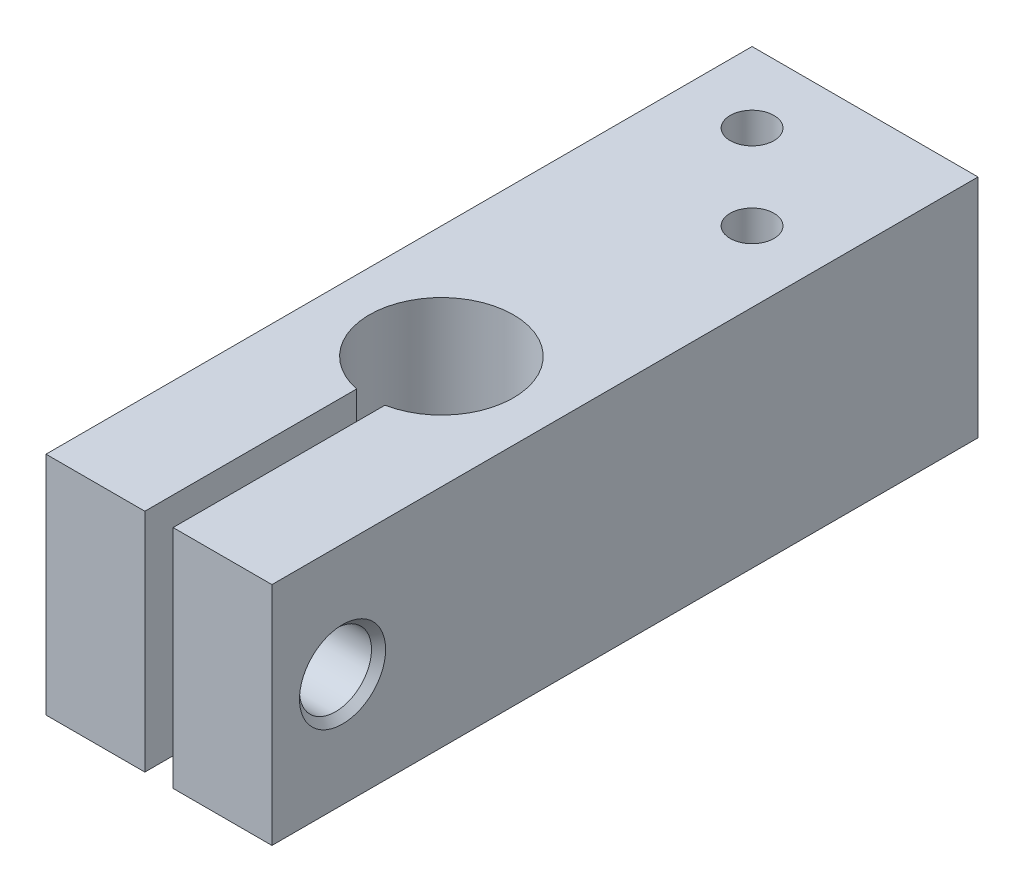
ISO-10303-21;
HEADER;
FILE_DESCRIPTION(('STEP AP214'),'2;1');
FILE_NAME('part.step','',(''),(''),'','','');
FILE_SCHEMA(('AUTOMOTIVE_DESIGN { 1 0 10303 214 1 1 1 1 }'));
ENDSEC;
DATA;
#1=APPLICATION_CONTEXT('core data for automotive mechanical design processes');
#2=APPLICATION_PROTOCOL_DEFINITION('international standard','automotive_design',2000,#1);
#3=PRODUCT_CONTEXT('',#1,'mechanical');
#4=PRODUCT('Part','Part','',(#3));
#5=PRODUCT_RELATED_PRODUCT_CATEGORY('part','',(#4));
#6=PRODUCT_DEFINITION_FORMATION('','',#4);
#7=PRODUCT_DEFINITION_CONTEXT('part definition',#1,'design');
#8=PRODUCT_DEFINITION('design','',#6,#7);
#9=PRODUCT_DEFINITION_SHAPE('','',#8);
#10=(LENGTH_UNIT() NAMED_UNIT(*) SI_UNIT(.MILLI.,.METRE.));
#11=(NAMED_UNIT(*) PLANE_ANGLE_UNIT() SI_UNIT($,.RADIAN.));
#12=(NAMED_UNIT(*) SI_UNIT($,.STERADIAN.) SOLID_ANGLE_UNIT());
#13=UNCERTAINTY_MEASURE_WITH_UNIT(LENGTH_MEASURE(1.E-05),#10,'distance_accuracy_value','');
#14=(GEOMETRIC_REPRESENTATION_CONTEXT(3) GLOBAL_UNCERTAINTY_ASSIGNED_CONTEXT((#13)) GLOBAL_UNIT_ASSIGNED_CONTEXT((#10,
#11,#12)) REPRESENTATION_CONTEXT('',''));
#15=CARTESIAN_POINT('',(0.,0.,0.));
#16=DIRECTION('',(0.,0.,1.));
#17=DIRECTION('',(1.,0.,0.));
#18=AXIS2_PLACEMENT_3D('',#15,#16,#17);
#19=CARTESIAN_POINT('',(8.,8.,50.));
#20=DIRECTION('',(0.,-1.,0.));
#21=DIRECTION('',(1.,0.,0.));
#22=AXIS2_PLACEMENT_3D('',#19,#20,#21);
#23=PLANE('',#22);
#24=CARTESIAN_POINT('',(3.,8.,11.));
#25=DIRECTION('',(0.,-1.,0.));
#26=DIRECTION('',(0.,0.,-1.));
#27=AXIS2_PLACEMENT_3D('',#24,#25,#26);
#28=CIRCLE('',#27,1.55);
#29=CARTESIAN_POINT('',(3.,8.,9.45));
#30=VERTEX_POINT('',#29);
#31=EDGE_CURVE('E335',#30,#30,#28,.T.);
#32=ORIENTED_EDGE('',*,*,#31,.T.);
#33=EDGE_LOOP('',(#32));
#34=FACE_BOUND('',#33,.T.);
#35=CARTESIAN_POINT('',(-3.,8.,5.));
#36=DIRECTION('',(0.,-1.,0.));
#37=DIRECTION('',(0.,0.,-1.));
#38=AXIS2_PLACEMENT_3D('',#35,#36,#37);
#39=CIRCLE('',#38,1.55);
#40=CARTESIAN_POINT('',(-3.,8.,3.45));
#41=VERTEX_POINT('',#40);
#42=EDGE_CURVE('E343',#41,#41,#39,.T.);
#43=ORIENTED_EDGE('',*,*,#42,.T.);
#44=EDGE_LOOP('',(#43));
#45=FACE_BOUND('',#44,.T.);
#46=CARTESIAN_POINT('',(0.,8.,30.));
#47=DIRECTION('',(0.,1.,0.));
#48=DIRECTION('',(0.,0.,1.));
#49=AXIS2_PLACEMENT_3D('',#46,#47,#48);
#50=CIRCLE('',#49,5.09999999999999);
#51=CARTESIAN_POINT('',(1.00000000000001,8.,35.00099990002));
#52=VERTEX_POINT('',#51);
#53=CARTESIAN_POINT('',(-0.999999999999999,8.,35.00099990002));
#54=VERTEX_POINT('',#53);
#55=EDGE_CURVE('E50',#52,#54,#50,.T.);
#56=ORIENTED_EDGE('',*,*,#55,.F.);
#57=DIRECTION('',(0.,0.,-1.));
#58=VECTOR('',#57,1.);
#59=CARTESIAN_POINT('',(1.00000000000001,8.,0.));
#60=LINE('',#59,#58);
#61=CARTESIAN_POINT('',(1.00000000000001,8.,50.));
#62=VERTEX_POINT('',#61);
#63=EDGE_CURVE('E108',#62,#52,#60,.T.);
#64=ORIENTED_EDGE('',*,*,#63,.F.);
#65=DIRECTION('',(-1.,0.,0.));
#66=VECTOR('',#65,1.);
#67=CARTESIAN_POINT('',(8.,8.,50.));
#68=LINE('',#67,#66);
#69=CARTESIAN_POINT('',(8.,8.,50.));
#70=VERTEX_POINT('',#69);
#71=EDGE_CURVE('E139',#70,#62,#68,.T.);
#72=ORIENTED_EDGE('',*,*,#71,.F.);
#73=DIRECTION('',(0.,0.,-1.));
#74=VECTOR('',#73,1.);
#75=CARTESIAN_POINT('',(8.,8.,50.));
#76=LINE('',#75,#74);
#77=CARTESIAN_POINT('',(8.,8.,0.));
#78=VERTEX_POINT('',#77);
#79=EDGE_CURVE('E151',#70,#78,#76,.T.);
#80=ORIENTED_EDGE('',*,*,#79,.T.);
#81=DIRECTION('',(-1.,0.,0.));
#82=VECTOR('',#81,1.);
#83=CARTESIAN_POINT('',(8.,8.,0.));
#84=LINE('',#83,#82);
#85=CARTESIAN_POINT('',(-8.,8.,0.));
#86=VERTEX_POINT('',#85);
#87=EDGE_CURVE('E132',#78,#86,#84,.T.);
#88=ORIENTED_EDGE('',*,*,#87,.T.);
#89=DIRECTION('',(0.,0.,-1.));
#90=VECTOR('',#89,1.);
#91=CARTESIAN_POINT('',(-8.,8.,50.));
#92=LINE('',#91,#90);
#93=CARTESIAN_POINT('',(-8.,8.,50.));
#94=VERTEX_POINT('',#93);
#95=EDGE_CURVE('E141',#94,#86,#92,.T.);
#96=ORIENTED_EDGE('',*,*,#95,.F.);
#97=CARTESIAN_POINT('',(-0.999999999999999,8.,50.));
#98=VERTEX_POINT('',#97);
#99=EDGE_CURVE('E138',#98,#94,#68,.T.);
#100=ORIENTED_EDGE('',*,*,#99,.F.);
#101=DIRECTION('',(0.,0.,-1.));
#102=VECTOR('',#101,1.);
#103=CARTESIAN_POINT('',(-1.00000000000001,8.,0.));
#104=LINE('',#103,#102);
#105=EDGE_CURVE('E57',#98,#54,#104,.T.);
#106=ORIENTED_EDGE('',*,*,#105,.T.);
#107=EDGE_LOOP('',(#56,#64,#72,#80,#88,#96,#100,#106));
#108=FACE_BOUND('',#107,.T.);
#109=ADVANCED_FACE('F36',(#34,#45,#108),#23,.F.);
#110=CARTESIAN_POINT('',(0.,0.,50.));
#111=DIRECTION('',(0.,0.,1.));
#112=DIRECTION('',(1.,0.,0.));
#113=AXIS2_PLACEMENT_3D('',#110,#111,#112);
#114=PLANE('',#113);
#115=DIRECTION('',(1.,0.,0.));
#116=VECTOR('',#115,1.);
#117=CARTESIAN_POINT('',(8.,-8.,50.));
#118=LINE('',#117,#116);
#119=CARTESIAN_POINT('',(-8.,-8.,50.));
#120=VERTEX_POINT('',#119);
#121=CARTESIAN_POINT('',(-0.999999999999995,-8.,50.));
#122=VERTEX_POINT('',#121);
#123=EDGE_CURVE('E133',#120,#122,#118,.T.);
#124=ORIENTED_EDGE('',*,*,#123,.T.);
#125=DIRECTION('',(0.,1.,0.));
#126=VECTOR('',#125,1.);
#127=CARTESIAN_POINT('',(-0.999999999999995,-8.,50.));
#128=LINE('',#127,#126);
#129=EDGE_CURVE('E126',#122,#98,#128,.T.);
#130=ORIENTED_EDGE('',*,*,#129,.T.);
#131=ORIENTED_EDGE('',*,*,#99,.T.);
#132=DIRECTION('',(0.,-1.,0.));
#133=VECTOR('',#132,1.);
#134=CARTESIAN_POINT('',(-8.,-8.,50.));
#135=LINE('',#134,#133);
#136=EDGE_CURVE('E128',#94,#120,#135,.T.);
#137=ORIENTED_EDGE('',*,*,#136,.T.);
#138=EDGE_LOOP('',(#124,#130,#131,#137));
#139=FACE_BOUND('',#138,.T.);
#140=ADVANCED_FACE('F192',(#139),#114,.T.);
#141=CARTESIAN_POINT('',(-8.,-8.,50.));
#142=DIRECTION('',(1.,0.,0.));
#143=DIRECTION('',(0.,0.,-1.));
#144=AXIS2_PLACEMENT_3D('',#141,#142,#143);
#145=PLANE('',#144);
#146=CARTESIAN_POINT('',(-8.,0.,45.));
#147=DIRECTION('',(-1.,0.,0.));
#148=DIRECTION('',(0.,0.,1.));
#149=AXIS2_PLACEMENT_3D('',#146,#147,#148);
#150=CIRCLE('',#149,2.1);
#151=CARTESIAN_POINT('',(-8.,0.,47.1));
#152=VERTEX_POINT('',#151);
#153=EDGE_CURVE('E333',#152,#152,#150,.T.);
#154=ORIENTED_EDGE('',*,*,#153,.F.);
#155=EDGE_LOOP('',(#154));
#156=FACE_BOUND('',#155,.T.);
#157=DIRECTION('',(0.,-1.,0.));
#158=VECTOR('',#157,1.);
#159=CARTESIAN_POINT('',(-8.,-8.,0.));
#160=LINE('',#159,#158);
#161=CARTESIAN_POINT('',(-8.,-8.,0.));
#162=VERTEX_POINT('',#161);
#163=EDGE_CURVE('E125',#86,#162,#160,.T.);
#164=ORIENTED_EDGE('',*,*,#163,.T.);
#165=DIRECTION('',(0.,0.,-1.));
#166=VECTOR('',#165,1.);
#167=CARTESIAN_POINT('',(-8.,-8.,50.));
#168=LINE('',#167,#166);
#169=EDGE_CURVE('E104',#120,#162,#168,.T.);
#170=ORIENTED_EDGE('',*,*,#169,.F.);
#171=ORIENTED_EDGE('',*,*,#136,.F.);
#172=ORIENTED_EDGE('',*,*,#95,.T.);
#173=EDGE_LOOP('',(#164,#170,#171,#172));
#174=FACE_BOUND('',#173,.T.);
#175=ADVANCED_FACE('F38',(#156,#174),#145,.F.);
#176=CARTESIAN_POINT('',(8.,-8.,50.));
#177=DIRECTION('',(0.,1.,0.));
#178=DIRECTION('',(-1.,0.,0.));
#179=AXIS2_PLACEMENT_3D('',#176,#177,#178);
#180=PLANE('',#179);
#181=CARTESIAN_POINT('',(-3.,-8.,5.));
#182=DIRECTION('',(0.,-1.,0.));
#183=DIRECTION('',(0.,0.,-1.));
#184=AXIS2_PLACEMENT_3D('',#181,#182,#183);
#185=CIRCLE('',#184,1.54999999999999);
#186=CARTESIAN_POINT('',(-3.,-8.,3.45000000000001));
#187=VERTEX_POINT('',#186);
#188=EDGE_CURVE('E346',#187,#187,#185,.T.);
#189=ORIENTED_EDGE('',*,*,#188,.F.);
#190=EDGE_LOOP('',(#189));
#191=FACE_BOUND('',#190,.T.);
#192=CARTESIAN_POINT('',(3.,-8.,11.));
#193=DIRECTION('',(0.,-1.,0.));
#194=DIRECTION('',(0.,0.,-1.));
#195=AXIS2_PLACEMENT_3D('',#192,#193,#194);
#196=CIRCLE('',#195,1.54999999999999);
#197=CARTESIAN_POINT('',(3.,-8.,9.45000000000001));
#198=VERTEX_POINT('',#197);
#199=EDGE_CURVE('E338',#198,#198,#196,.T.);
#200=ORIENTED_EDGE('',*,*,#199,.F.);
#201=EDGE_LOOP('',(#200));
#202=FACE_BOUND('',#201,.T.);
#203=DIRECTION('',(0.,0.,-1.));
#204=VECTOR('',#203,1.);
#205=CARTESIAN_POINT('',(1.00000000000001,-8.,0.));
#206=LINE('',#205,#204);
#207=CARTESIAN_POINT('',(1.00000000000001,-8.,50.));
#208=VERTEX_POINT('',#207);
#209=CARTESIAN_POINT('',(1.00000000000001,-8.,35.00099990002));
#210=VERTEX_POINT('',#209);
#211=EDGE_CURVE('E118',#208,#210,#206,.T.);
#212=ORIENTED_EDGE('',*,*,#211,.T.);
#213=CARTESIAN_POINT('',(0.,-8.,30.));
#214=DIRECTION('',(0.,1.,0.));
#215=DIRECTION('',(0.,0.,1.));
#216=AXIS2_PLACEMENT_3D('',#213,#214,#215);
#217=CIRCLE('',#216,5.1);
#218=CARTESIAN_POINT('',(-1.,-8.,35.00099990002));
#219=VERTEX_POINT('',#218);
#220=EDGE_CURVE('E100',#210,#219,#217,.T.);
#221=ORIENTED_EDGE('',*,*,#220,.T.);
#222=DIRECTION('',(0.,0.,-1.));
#223=VECTOR('',#222,1.);
#224=CARTESIAN_POINT('',(-1.00000000000001,-8.,0.));
#225=LINE('',#224,#223);
#226=EDGE_CURVE('E115',#122,#219,#225,.T.);
#227=ORIENTED_EDGE('',*,*,#226,.F.);
#228=ORIENTED_EDGE('',*,*,#123,.F.);
#229=ORIENTED_EDGE('',*,*,#169,.T.);
#230=DIRECTION('',(1.,0.,0.));
#231=VECTOR('',#230,1.);
#232=CARTESIAN_POINT('',(8.,-8.,0.));
#233=LINE('',#232,#231);
#234=CARTESIAN_POINT('',(8.,-8.,0.));
#235=VERTEX_POINT('',#234);
#236=EDGE_CURVE('E144',#162,#235,#233,.T.);
#237=ORIENTED_EDGE('',*,*,#236,.T.);
#238=DIRECTION('',(0.,0.,-1.));
#239=VECTOR('',#238,1.);
#240=CARTESIAN_POINT('',(8.,-8.,50.));
#241=LINE('',#240,#239);
#242=CARTESIAN_POINT('',(8.,-8.,50.));
#243=VERTEX_POINT('',#242);
#244=EDGE_CURVE('E154',#243,#235,#241,.T.);
#245=ORIENTED_EDGE('',*,*,#244,.F.);
#246=EDGE_CURVE('E131',#208,#243,#118,.T.);
#247=ORIENTED_EDGE('',*,*,#246,.F.);
#248=EDGE_LOOP('',(#212,#221,#227,#228,#229,#237,#245,#247));
#249=FACE_BOUND('',#248,.T.);
#250=ADVANCED_FACE('F174',(#191,#202,#249),#180,.F.);
#251=CARTESIAN_POINT('',(8.,-8.,50.));
#252=DIRECTION('',(-1.,0.,0.));
#253=DIRECTION('',(0.,0.,1.));
#254=AXIS2_PLACEMENT_3D('',#251,#252,#253);
#255=PLANE('',#254);
#256=CARTESIAN_POINT('',(8.,0.,45.));
#257=DIRECTION('',(1.,0.,0.));
#258=DIRECTION('',(0.,0.,-1.));
#259=AXIS2_PLACEMENT_3D('',#256,#257,#258);
#260=CIRCLE('',#259,3.05);
#261=CARTESIAN_POINT('',(8.,0.,41.95));
#262=VERTEX_POINT('',#261);
#263=EDGE_CURVE('E164',#262,#262,#260,.T.);
#264=ORIENTED_EDGE('',*,*,#263,.F.);
#265=EDGE_LOOP('',(#264));
#266=FACE_BOUND('',#265,.T.);
#267=DIRECTION('',(0.,1.,0.));
#268=VECTOR('',#267,1.);
#269=CARTESIAN_POINT('',(8.,-8.,0.));
#270=LINE('',#269,#268);
#271=EDGE_CURVE('E146',#235,#78,#270,.T.);
#272=ORIENTED_EDGE('',*,*,#271,.T.);
#273=ORIENTED_EDGE('',*,*,#79,.F.);
#274=DIRECTION('',(0.,1.,0.));
#275=VECTOR('',#274,1.);
#276=CARTESIAN_POINT('',(8.,-8.,50.));
#277=LINE('',#276,#275);
#278=EDGE_CURVE('E136',#243,#70,#277,.T.);
#279=ORIENTED_EDGE('',*,*,#278,.F.);
#280=ORIENTED_EDGE('',*,*,#244,.T.);
#281=EDGE_LOOP('',(#272,#273,#279,#280));
#282=FACE_BOUND('',#281,.T.);
#283=ADVANCED_FACE('F195',(#266,#282),#255,.F.);
#284=DIRECTION('',(0.,1.,0.));
#285=VECTOR('',#284,1.);
#286=CARTESIAN_POINT('',(1.00000000000001,-8.,50.));
#287=LINE('',#286,#285);
#288=EDGE_CURVE('E114',#208,#62,#287,.T.);
#289=ORIENTED_EDGE('',*,*,#288,.F.);
#290=ORIENTED_EDGE('',*,*,#246,.T.);
#291=ORIENTED_EDGE('',*,*,#278,.T.);
#292=ORIENTED_EDGE('',*,*,#71,.T.);
#293=EDGE_LOOP('',(#289,#290,#291,#292));
#294=FACE_BOUND('',#293,.T.);
#295=ADVANCED_FACE('F178',(#294),#114,.T.);
#296=CARTESIAN_POINT('',(0.,0.,0.));
#297=DIRECTION('',(0.,0.,1.));
#298=DIRECTION('',(1.,0.,0.));
#299=AXIS2_PLACEMENT_3D('',#296,#297,#298);
#300=PLANE('',#299);
#301=ORIENTED_EDGE('',*,*,#163,.F.);
#302=ORIENTED_EDGE('',*,*,#87,.F.);
#303=ORIENTED_EDGE('',*,*,#271,.F.);
#304=ORIENTED_EDGE('',*,*,#236,.F.);
#305=EDGE_LOOP('',(#301,#302,#303,#304));
#306=FACE_BOUND('',#305,.T.);
#307=ADVANCED_FACE('F187',(#306),#300,.F.);
#308=CARTESIAN_POINT('',(1.00000000000001,-8.,0.));
#309=DIRECTION('',(1.,0.,0.));
#310=DIRECTION('',(0.,1.,0.));
#311=AXIS2_PLACEMENT_3D('',#308,#309,#310);
#312=PLANE('',#311);
#313=CARTESIAN_POINT('',(1.00000000000001,0.,45.));
#314=DIRECTION('',(1.,0.,0.));
#315=DIRECTION('',(0.,1.,0.));
#316=AXIS2_PLACEMENT_3D('',#313,#314,#315);
#317=CIRCLE('',#316,2.54999999999999);
#318=CARTESIAN_POINT('',(1.00000000000001,2.54999999999999,45.));
#319=VERTEX_POINT('',#318);
#320=EDGE_CURVE('E120',#319,#319,#317,.T.);
#321=ORIENTED_EDGE('',*,*,#320,.T.);
#322=EDGE_LOOP('',(#321));
#323=FACE_BOUND('',#322,.T.);
#324=ORIENTED_EDGE('',*,*,#63,.T.);
#325=DIRECTION('',(0.,1.,0.));
#326=VECTOR('',#325,1.);
#327=CARTESIAN_POINT('',(1.00000000000001,8.,35.00099990002));
#328=LINE('',#327,#326);
#329=EDGE_CURVE('E44',#52,#210,#328,.F.);
#330=ORIENTED_EDGE('',*,*,#329,.T.);
#331=ORIENTED_EDGE('',*,*,#211,.F.);
#332=ORIENTED_EDGE('',*,*,#288,.T.);
#333=EDGE_LOOP('',(#324,#330,#331,#332));
#334=FACE_BOUND('',#333,.T.);
#335=ADVANCED_FACE('F112',(#323,#334),#312,.F.);
#336=CARTESIAN_POINT('',(-1.00000000000001,-8.,0.));
#337=DIRECTION('',(1.,0.,0.));
#338=DIRECTION('',(0.,0.,-1.));
#339=AXIS2_PLACEMENT_3D('',#336,#337,#338);
#340=PLANE('',#339);
#341=DIRECTION('',(0.,1.,0.));
#342=VECTOR('',#341,1.);
#343=CARTESIAN_POINT('',(-0.999999999999998,8.,35.00099990002));
#344=LINE('',#343,#342);
#345=EDGE_CURVE('E11',#54,#219,#344,.F.);
#346=ORIENTED_EDGE('',*,*,#345,.F.);
#347=ORIENTED_EDGE('',*,*,#105,.F.);
#348=ORIENTED_EDGE('',*,*,#129,.F.);
#349=ORIENTED_EDGE('',*,*,#226,.T.);
#350=EDGE_LOOP('',(#346,#347,#348,#349));
#351=FACE_BOUND('',#350,.T.);
#352=CARTESIAN_POINT('',(-0.999999999999995,0.,45.));
#353=DIRECTION('',(1.,0.,0.));
#354=DIRECTION('',(0.,0.,-1.));
#355=AXIS2_PLACEMENT_3D('',#352,#353,#354);
#356=CIRCLE('',#355,2.1);
#357=CARTESIAN_POINT('',(-0.999999999999995,0.,42.9));
#358=VERTEX_POINT('',#357);
#359=EDGE_CURVE('E169',#358,#358,#356,.T.);
#360=ORIENTED_EDGE('',*,*,#359,.F.);
#361=EDGE_LOOP('',(#360));
#362=FACE_BOUND('',#361,.T.);
#363=ADVANCED_FACE('F193',(#351,#362),#340,.T.);
#364=CARTESIAN_POINT('',(8.,0.,45.));
#365=DIRECTION('',(1.,0.,0.));
#366=DIRECTION('',(0.,0.,-1.));
#367=AXIS2_PLACEMENT_3D('',#364,#365,#366);
#368=CYLINDRICAL_SURFACE('',#367,2.54999999999999);
#369=CARTESIAN_POINT('',(7.5,0.,45.));
#370=DIRECTION('',(1.,0.,0.));
#371=DIRECTION('',(0.,0.,-1.));
#372=AXIS2_PLACEMENT_3D('',#369,#370,#371);
#373=CIRCLE('',#372,2.55);
#374=CARTESIAN_POINT('',(7.5,0.,42.45));
#375=VERTEX_POINT('',#374);
#376=EDGE_CURVE('E160',#375,#375,#373,.T.);
#377=ORIENTED_EDGE('',*,*,#376,.T.);
#378=EDGE_LOOP('',(#377));
#379=FACE_BOUND('',#378,.T.);
#380=ORIENTED_EDGE('',*,*,#320,.F.);
#381=EDGE_LOOP('',(#380));
#382=FACE_BOUND('',#381,.T.);
#383=ADVANCED_FACE('F219',(#379,#382),#368,.F.);
#384=CARTESIAN_POINT('',(8.,0.,45.));
#385=DIRECTION('',(1.,0.,0.));
#386=DIRECTION('',(0.,0.,-1.));
#387=AXIS2_PLACEMENT_3D('',#384,#385,#386);
#388=CONICAL_SURFACE('',#387,3.05,0.78539816339745);
#389=ORIENTED_EDGE('',*,*,#376,.F.);
#390=EDGE_LOOP('',(#389));
#391=FACE_BOUND('',#390,.T.);
#392=ORIENTED_EDGE('',*,*,#263,.T.);
#393=EDGE_LOOP('',(#392));
#394=FACE_BOUND('',#393,.T.);
#395=ADVANCED_FACE('F224',(#391,#394),#388,.F.);
#396=CARTESIAN_POINT('',(-8.,0.,45.));
#397=DIRECTION('',(-1.,0.,0.));
#398=DIRECTION('',(0.,0.,1.));
#399=AXIS2_PLACEMENT_3D('',#396,#397,#398);
#400=CYLINDRICAL_SURFACE('',#399,2.1);
#401=ORIENTED_EDGE('',*,*,#359,.T.);
#402=EDGE_LOOP('',(#401));
#403=FACE_BOUND('',#402,.T.);
#404=ORIENTED_EDGE('',*,*,#153,.T.);
#405=EDGE_LOOP('',(#404));
#406=FACE_BOUND('',#405,.T.);
#407=ADVANCED_FACE('F227',(#403,#406),#400,.F.);
#408=CARTESIAN_POINT('',(3.,-8.,11.));
#409=DIRECTION('',(0.,-1.,0.));
#410=DIRECTION('',(0.,0.,-1.));
#411=AXIS2_PLACEMENT_3D('',#408,#409,#410);
#412=CYLINDRICAL_SURFACE('',#411,1.54999999999999);
#413=ORIENTED_EDGE('',*,*,#31,.F.);
#414=EDGE_LOOP('',(#413));
#415=FACE_BOUND('',#414,.T.);
#416=ORIENTED_EDGE('',*,*,#199,.T.);
#417=EDGE_LOOP('',(#416));
#418=FACE_BOUND('',#417,.T.);
#419=ADVANCED_FACE('F231',(#415,#418),#412,.F.);
#420=CARTESIAN_POINT('',(-3.,-8.,5.));
#421=DIRECTION('',(0.,-1.,0.));
#422=DIRECTION('',(0.,0.,-1.));
#423=AXIS2_PLACEMENT_3D('',#420,#421,#422);
#424=CYLINDRICAL_SURFACE('',#423,1.54999999999999);
#425=ORIENTED_EDGE('',*,*,#42,.F.);
#426=EDGE_LOOP('',(#425));
#427=FACE_BOUND('',#426,.T.);
#428=ORIENTED_EDGE('',*,*,#188,.T.);
#429=EDGE_LOOP('',(#428));
#430=FACE_BOUND('',#429,.T.);
#431=ADVANCED_FACE('F235',(#427,#430),#424,.F.);
#432=CARTESIAN_POINT('',(0.,8.,30.));
#433=DIRECTION('',(0.,1.,0.));
#434=DIRECTION('',(0.,0.,1.));
#435=AXIS2_PLACEMENT_3D('',#432,#433,#434);
#436=CYLINDRICAL_SURFACE('',#435,5.09999999999999);
#437=ORIENTED_EDGE('',*,*,#55,.T.);
#438=ORIENTED_EDGE('',*,*,#345,.T.);
#439=ORIENTED_EDGE('',*,*,#220,.F.);
#440=ORIENTED_EDGE('',*,*,#329,.F.);
#441=EDGE_LOOP('',(#437,#438,#439,#440));
#442=FACE_BOUND('',#441,.T.);
#443=ADVANCED_FACE('F98',(#442),#436,.F.);
#444=CLOSED_SHELL('',(#109,#140,#175,#250,#283,#295,#307,#335,#363,#383,#395,#407,#419,#431,#443));
#445=MANIFOLD_SOLID_BREP('B2',#444);
#446=ADVANCED_BREP_SHAPE_REPRESENTATION('',(#18,#445),#14);
#447=SHAPE_DEFINITION_REPRESENTATION(#9,#446);
ENDSEC;
END-ISO-10303-21;
